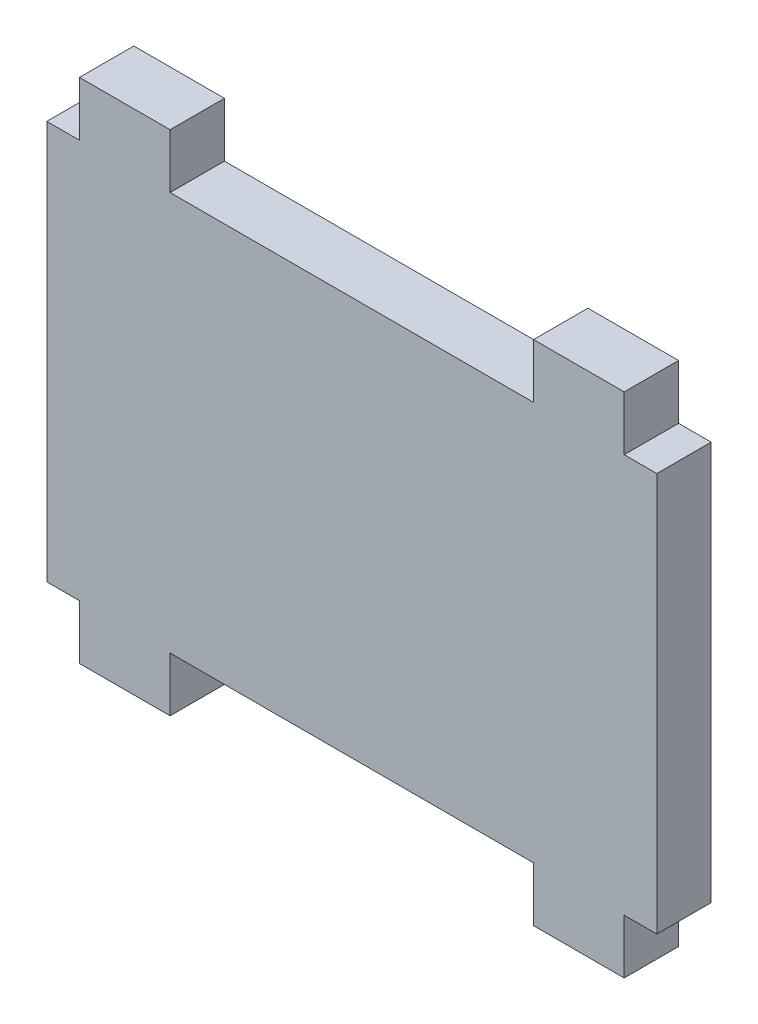
ISO-10303-21;
HEADER;
FILE_DESCRIPTION(('STEP AP214'),'2;1');
FILE_NAME('part.step','',(''),(''),'','','');
FILE_SCHEMA(('AUTOMOTIVE_DESIGN { 1 0 10303 214 1 1 1 1 }'));
ENDSEC;
DATA;
#1=APPLICATION_CONTEXT('core data for automotive mechanical design processes');
#2=APPLICATION_PROTOCOL_DEFINITION('international standard','automotive_design',2000,#1);
#3=PRODUCT_CONTEXT('',#1,'mechanical');
#4=PRODUCT('Part','Part','',(#3));
#5=PRODUCT_RELATED_PRODUCT_CATEGORY('part','',(#4));
#6=PRODUCT_DEFINITION_FORMATION('','',#4);
#7=PRODUCT_DEFINITION_CONTEXT('part definition',#1,'design');
#8=PRODUCT_DEFINITION('design','',#6,#7);
#9=PRODUCT_DEFINITION_SHAPE('','',#8);
#10=(LENGTH_UNIT() NAMED_UNIT(*) SI_UNIT(.MILLI.,.METRE.));
#11=(NAMED_UNIT(*) PLANE_ANGLE_UNIT() SI_UNIT($,.RADIAN.));
#12=(NAMED_UNIT(*) SI_UNIT($,.STERADIAN.) SOLID_ANGLE_UNIT());
#13=UNCERTAINTY_MEASURE_WITH_UNIT(LENGTH_MEASURE(1.E-05),#10,'distance_accuracy_value','');
#14=(GEOMETRIC_REPRESENTATION_CONTEXT(3) GLOBAL_UNCERTAINTY_ASSIGNED_CONTEXT((#13)) GLOBAL_UNIT_ASSIGNED_CONTEXT((#10,
#11,#12)) REPRESENTATION_CONTEXT('',''));
#15=CARTESIAN_POINT('',(0.,0.,0.));
#16=DIRECTION('',(0.,0.,1.));
#17=DIRECTION('',(1.,0.,0.));
#18=AXIS2_PLACEMENT_3D('',#15,#16,#17);
#19=CARTESIAN_POINT('',(6.8,0.,3.));
#20=DIRECTION('',(1.,0.,0.));
#21=DIRECTION('',(0.,0.,-1.));
#22=AXIS2_PLACEMENT_3D('',#19,#20,#21);
#23=PLANE('',#22);
#24=DIRECTION('',(0.,-1.,0.));
#25=VECTOR('',#24,1.);
#26=CARTESIAN_POINT('',(6.8,0.,0.));
#27=LINE('',#26,#25);
#28=CARTESIAN_POINT('',(6.8,0.,0.));
#29=VERTEX_POINT('',#28);
#30=CARTESIAN_POINT('',(6.8,-3.,0.));
#31=VERTEX_POINT('',#30);
#32=EDGE_CURVE('E209',#29,#31,#27,.T.);
#33=ORIENTED_EDGE('',*,*,#32,.F.);
#34=DIRECTION('',(0.,0.,-1.));
#35=VECTOR('',#34,1.);
#36=CARTESIAN_POINT('',(6.8,0.,3.));
#37=LINE('',#36,#35);
#38=CARTESIAN_POINT('',(6.8,0.,3.));
#39=VERTEX_POINT('',#38);
#40=EDGE_CURVE('E11',#39,#29,#37,.T.);
#41=ORIENTED_EDGE('',*,*,#40,.F.);
#42=DIRECTION('',(0.,-1.,0.));
#43=VECTOR('',#42,1.);
#44=CARTESIAN_POINT('',(6.8,0.,3.));
#45=LINE('',#44,#43);
#46=CARTESIAN_POINT('',(6.8,-3.,3.));
#47=VERTEX_POINT('',#46);
#48=EDGE_CURVE('E281',#39,#47,#45,.T.);
#49=ORIENTED_EDGE('',*,*,#48,.T.);
#50=DIRECTION('',(0.,0.,-1.));
#51=VECTOR('',#50,1.);
#52=CARTESIAN_POINT('',(6.8,-3.,3.));
#53=LINE('',#52,#51);
#54=EDGE_CURVE('E127',#47,#31,#53,.T.);
#55=ORIENTED_EDGE('',*,*,#54,.T.);
#56=EDGE_LOOP('',(#33,#41,#49,#55));
#57=FACE_BOUND('',#56,.T.);
#58=ADVANCED_FACE('F39',(#57),#23,.T.);
#59=CARTESIAN_POINT('',(0.,0.,3.));
#60=DIRECTION('',(0.,1.,0.));
#61=DIRECTION('',(0.,0.,1.));
#62=AXIS2_PLACEMENT_3D('',#59,#60,#61);
#63=PLANE('',#62);
#64=DIRECTION('',(1.,0.,0.));
#65=VECTOR('',#64,1.);
#66=CARTESIAN_POINT('',(0.,0.,0.));
#67=LINE('',#66,#65);
#68=CARTESIAN_POINT('',(26.85,0.,0.));
#69=VERTEX_POINT('',#68);
#70=EDGE_CURVE('E213',#29,#69,#67,.T.);
#71=ORIENTED_EDGE('',*,*,#70,.T.);
#72=DIRECTION('',(0.,0.,-1.));
#73=VECTOR('',#72,1.);
#74=CARTESIAN_POINT('',(26.85,0.,3.));
#75=LINE('',#74,#73);
#76=CARTESIAN_POINT('',(26.85,0.,3.));
#77=VERTEX_POINT('',#76);
#78=EDGE_CURVE('E48',#77,#69,#75,.T.);
#79=ORIENTED_EDGE('',*,*,#78,.F.);
#80=DIRECTION('',(1.,0.,0.));
#81=VECTOR('',#80,1.);
#82=CARTESIAN_POINT('',(0.,0.,3.));
#83=LINE('',#82,#81);
#84=EDGE_CURVE('E361',#39,#77,#83,.T.);
#85=ORIENTED_EDGE('',*,*,#84,.F.);
#86=ORIENTED_EDGE('',*,*,#40,.T.);
#87=EDGE_LOOP('',(#71,#79,#85,#86));
#88=FACE_BOUND('',#87,.T.);
#89=ADVANCED_FACE('F414',(#88),#63,.F.);
#90=CARTESIAN_POINT('',(26.85,0.,3.));
#91=DIRECTION('',(1.,0.,0.));
#92=DIRECTION('',(0.,0.,-1.));
#93=AXIS2_PLACEMENT_3D('',#90,#91,#92);
#94=PLANE('',#93);
#95=DIRECTION('',(0.,-1.,0.));
#96=VECTOR('',#95,1.);
#97=CARTESIAN_POINT('',(26.85,0.,0.));
#98=LINE('',#97,#96);
#99=CARTESIAN_POINT('',(26.85,-3.,0.));
#100=VERTEX_POINT('',#99);
#101=EDGE_CURVE('E216',#69,#100,#98,.T.);
#102=ORIENTED_EDGE('',*,*,#101,.T.);
#103=DIRECTION('',(0.,0.,-1.));
#104=VECTOR('',#103,1.);
#105=CARTESIAN_POINT('',(26.85,-3.,3.));
#106=LINE('',#105,#104);
#107=CARTESIAN_POINT('',(26.85,-3.,3.));
#108=VERTEX_POINT('',#107);
#109=EDGE_CURVE('E328',#108,#100,#106,.T.);
#110=ORIENTED_EDGE('',*,*,#109,.F.);
#111=DIRECTION('',(0.,-1.,0.));
#112=VECTOR('',#111,1.);
#113=CARTESIAN_POINT('',(26.85,0.,3.));
#114=LINE('',#113,#112);
#115=EDGE_CURVE('E339',#77,#108,#114,.T.);
#116=ORIENTED_EDGE('',*,*,#115,.F.);
#117=ORIENTED_EDGE('',*,*,#78,.T.);
#118=EDGE_LOOP('',(#102,#110,#116,#117));
#119=FACE_BOUND('',#118,.T.);
#120=ADVANCED_FACE('F337',(#119),#94,.F.);
#121=CARTESIAN_POINT('',(0.,-3.,3.));
#122=DIRECTION('',(0.,1.,0.));
#123=DIRECTION('',(0.,0.,1.));
#124=AXIS2_PLACEMENT_3D('',#121,#122,#123);
#125=PLANE('',#124);
#126=DIRECTION('',(1.,0.,0.));
#127=VECTOR('',#126,1.);
#128=CARTESIAN_POINT('',(0.,-3.,0.));
#129=LINE('',#128,#127);
#130=CARTESIAN_POINT('',(31.85,-3.,0.));
#131=VERTEX_POINT('',#130);
#132=EDGE_CURVE('E219',#100,#131,#129,.T.);
#133=ORIENTED_EDGE('',*,*,#132,.T.);
#134=DIRECTION('',(0.,0.,-1.));
#135=VECTOR('',#134,1.);
#136=CARTESIAN_POINT('',(31.85,-3.,3.));
#137=LINE('',#136,#135);
#138=CARTESIAN_POINT('',(31.85,-3.,3.));
#139=VERTEX_POINT('',#138);
#140=EDGE_CURVE('E325',#139,#131,#137,.T.);
#141=ORIENTED_EDGE('',*,*,#140,.F.);
#142=DIRECTION('',(1.,0.,0.));
#143=VECTOR('',#142,1.);
#144=CARTESIAN_POINT('',(0.,-3.,3.));
#145=LINE('',#144,#143);
#146=EDGE_CURVE('E352',#108,#139,#145,.T.);
#147=ORIENTED_EDGE('',*,*,#146,.F.);
#148=ORIENTED_EDGE('',*,*,#109,.T.);
#149=EDGE_LOOP('',(#133,#141,#147,#148));
#150=FACE_BOUND('',#149,.T.);
#151=ADVANCED_FACE('F349',(#150),#125,.F.);
#152=CARTESIAN_POINT('',(31.85,0.,3.));
#153=DIRECTION('',(1.,0.,0.));
#154=DIRECTION('',(0.,0.,-1.));
#155=AXIS2_PLACEMENT_3D('',#152,#153,#154);
#156=PLANE('',#155);
#157=DIRECTION('',(0.,-1.,0.));
#158=VECTOR('',#157,1.);
#159=CARTESIAN_POINT('',(31.85,0.,0.));
#160=LINE('',#159,#158);
#161=CARTESIAN_POINT('',(31.85,0.,0.));
#162=VERTEX_POINT('',#161);
#163=EDGE_CURVE('E223',#162,#131,#160,.T.);
#164=ORIENTED_EDGE('',*,*,#163,.F.);
#165=DIRECTION('',(0.,0.,-1.));
#166=VECTOR('',#165,1.);
#167=CARTESIAN_POINT('',(31.85,0.,3.));
#168=LINE('',#167,#166);
#169=CARTESIAN_POINT('',(31.85,0.,3.));
#170=VERTEX_POINT('',#169);
#171=EDGE_CURVE('E322',#170,#162,#168,.T.);
#172=ORIENTED_EDGE('',*,*,#171,.F.);
#173=DIRECTION('',(0.,-1.,0.));
#174=VECTOR('',#173,1.);
#175=CARTESIAN_POINT('',(31.85,0.,3.));
#176=LINE('',#175,#174);
#177=EDGE_CURVE('E355',#170,#139,#176,.T.);
#178=ORIENTED_EDGE('',*,*,#177,.T.);
#179=ORIENTED_EDGE('',*,*,#140,.T.);
#180=EDGE_LOOP('',(#164,#172,#178,#179));
#181=FACE_BOUND('',#180,.T.);
#182=ADVANCED_FACE('F424',(#181),#156,.T.);
#183=CARTESIAN_POINT('',(0.,0.,3.));
#184=DIRECTION('',(0.,1.,0.));
#185=DIRECTION('',(0.,0.,1.));
#186=AXIS2_PLACEMENT_3D('',#183,#184,#185);
#187=PLANE('',#186);
#188=DIRECTION('',(1.,0.,0.));
#189=VECTOR('',#188,1.);
#190=CARTESIAN_POINT('',(0.,0.,0.));
#191=LINE('',#190,#189);
#192=CARTESIAN_POINT('',(33.65,0.,0.));
#193=VERTEX_POINT('',#192);
#194=EDGE_CURVE('E227',#162,#193,#191,.T.);
#195=ORIENTED_EDGE('',*,*,#194,.T.);
#196=DIRECTION('',(0.,0.,-1.));
#197=VECTOR('',#196,1.);
#198=CARTESIAN_POINT('',(33.65,0.,3.));
#199=LINE('',#198,#197);
#200=CARTESIAN_POINT('',(33.65,0.,3.));
#201=VERTEX_POINT('',#200);
#202=EDGE_CURVE('E318',#201,#193,#199,.T.);
#203=ORIENTED_EDGE('',*,*,#202,.F.);
#204=DIRECTION('',(1.,0.,0.));
#205=VECTOR('',#204,1.);
#206=CARTESIAN_POINT('',(0.,0.,3.));
#207=LINE('',#206,#205);
#208=EDGE_CURVE('E359',#170,#201,#207,.T.);
#209=ORIENTED_EDGE('',*,*,#208,.F.);
#210=ORIENTED_EDGE('',*,*,#171,.T.);
#211=EDGE_LOOP('',(#195,#203,#209,#210));
#212=FACE_BOUND('',#211,.T.);
#213=ADVANCED_FACE('F427',(#212),#187,.F.);
#214=CARTESIAN_POINT('',(33.65,0.,3.));
#215=DIRECTION('',(-1.,0.,0.));
#216=DIRECTION('',(0.,0.,1.));
#217=AXIS2_PLACEMENT_3D('',#214,#215,#216);
#218=PLANE('',#217);
#219=DIRECTION('',(0.,1.,0.));
#220=VECTOR('',#219,1.);
#221=CARTESIAN_POINT('',(33.65,0.,0.));
#222=LINE('',#221,#220);
#223=CARTESIAN_POINT('',(33.65,22.,0.));
#224=VERTEX_POINT('',#223);
#225=EDGE_CURVE('E230',#193,#224,#222,.T.);
#226=ORIENTED_EDGE('',*,*,#225,.T.);
#227=DIRECTION('',(0.,0.,-1.));
#228=VECTOR('',#227,1.);
#229=CARTESIAN_POINT('',(33.65,22.,3.));
#230=LINE('',#229,#228);
#231=CARTESIAN_POINT('',(33.65,22.,3.));
#232=VERTEX_POINT('',#231);
#233=EDGE_CURVE('E315',#232,#224,#230,.T.);
#234=ORIENTED_EDGE('',*,*,#233,.F.);
#235=DIRECTION('',(0.,1.,0.));
#236=VECTOR('',#235,1.);
#237=CARTESIAN_POINT('',(33.65,0.,3.));
#238=LINE('',#237,#236);
#239=EDGE_CURVE('E367',#201,#232,#238,.T.);
#240=ORIENTED_EDGE('',*,*,#239,.F.);
#241=ORIENTED_EDGE('',*,*,#202,.T.);
#242=EDGE_LOOP('',(#226,#234,#240,#241));
#243=FACE_BOUND('',#242,.T.);
#244=ADVANCED_FACE('F431',(#243),#218,.F.);
#245=CARTESIAN_POINT('',(0.,22.,3.));
#246=DIRECTION('',(0.,1.,0.));
#247=DIRECTION('',(0.,0.,1.));
#248=AXIS2_PLACEMENT_3D('',#245,#246,#247);
#249=PLANE('',#248);
#250=DIRECTION('',(1.,0.,0.));
#251=VECTOR('',#250,1.);
#252=CARTESIAN_POINT('',(0.,22.,0.));
#253=LINE('',#252,#251);
#254=CARTESIAN_POINT('',(31.85,22.,0.));
#255=VERTEX_POINT('',#254);
#256=EDGE_CURVE('E234',#255,#224,#253,.T.);
#257=ORIENTED_EDGE('',*,*,#256,.F.);
#258=DIRECTION('',(0.,0.,-1.));
#259=VECTOR('',#258,1.);
#260=CARTESIAN_POINT('',(31.85,22.,3.));
#261=LINE('',#260,#259);
#262=CARTESIAN_POINT('',(31.85,22.,3.));
#263=VERTEX_POINT('',#262);
#264=EDGE_CURVE('E312',#263,#255,#261,.T.);
#265=ORIENTED_EDGE('',*,*,#264,.F.);
#266=DIRECTION('',(1.,0.,0.));
#267=VECTOR('',#266,1.);
#268=CARTESIAN_POINT('',(0.,22.,3.));
#269=LINE('',#268,#267);
#270=EDGE_CURVE('E370',#263,#232,#269,.T.);
#271=ORIENTED_EDGE('',*,*,#270,.T.);
#272=ORIENTED_EDGE('',*,*,#233,.T.);
#273=EDGE_LOOP('',(#257,#265,#271,#272));
#274=FACE_BOUND('',#273,.T.);
#275=ADVANCED_FACE('F435',(#274),#249,.T.);
#276=CARTESIAN_POINT('',(31.85,0.,3.));
#277=DIRECTION('',(-1.,0.,0.));
#278=DIRECTION('',(0.,0.,1.));
#279=AXIS2_PLACEMENT_3D('',#276,#277,#278);
#280=PLANE('',#279);
#281=DIRECTION('',(0.,1.,0.));
#282=VECTOR('',#281,1.);
#283=CARTESIAN_POINT('',(31.85,0.,0.));
#284=LINE('',#283,#282);
#285=CARTESIAN_POINT('',(31.85,25.,0.));
#286=VERTEX_POINT('',#285);
#287=EDGE_CURVE('E238',#255,#286,#284,.T.);
#288=ORIENTED_EDGE('',*,*,#287,.T.);
#289=DIRECTION('',(0.,0.,-1.));
#290=VECTOR('',#289,1.);
#291=CARTESIAN_POINT('',(31.85,25.,3.));
#292=LINE('',#291,#290);
#293=CARTESIAN_POINT('',(31.85,25.,3.));
#294=VERTEX_POINT('',#293);
#295=EDGE_CURVE('E309',#294,#286,#292,.T.);
#296=ORIENTED_EDGE('',*,*,#295,.F.);
#297=DIRECTION('',(0.,1.,0.));
#298=VECTOR('',#297,1.);
#299=CARTESIAN_POINT('',(31.85,0.,3.));
#300=LINE('',#299,#298);
#301=EDGE_CURVE('E374',#263,#294,#300,.T.);
#302=ORIENTED_EDGE('',*,*,#301,.F.);
#303=ORIENTED_EDGE('',*,*,#264,.T.);
#304=EDGE_LOOP('',(#288,#296,#302,#303));
#305=FACE_BOUND('',#304,.T.);
#306=ADVANCED_FACE('F439',(#305),#280,.F.);
#307=CARTESIAN_POINT('',(0.,25.,3.));
#308=DIRECTION('',(0.,1.,0.));
#309=DIRECTION('',(0.,0.,1.));
#310=AXIS2_PLACEMENT_3D('',#307,#308,#309);
#311=PLANE('',#310);
#312=DIRECTION('',(1.,0.,0.));
#313=VECTOR('',#312,1.);
#314=CARTESIAN_POINT('',(0.,25.,0.));
#315=LINE('',#314,#313);
#316=CARTESIAN_POINT('',(26.85,25.,0.));
#317=VERTEX_POINT('',#316);
#318=EDGE_CURVE('E242',#317,#286,#315,.T.);
#319=ORIENTED_EDGE('',*,*,#318,.F.);
#320=DIRECTION('',(0.,0.,-1.));
#321=VECTOR('',#320,1.);
#322=CARTESIAN_POINT('',(26.85,25.,3.));
#323=LINE('',#322,#321);
#324=CARTESIAN_POINT('',(26.85,25.,3.));
#325=VERTEX_POINT('',#324);
#326=EDGE_CURVE('E306',#325,#317,#323,.T.);
#327=ORIENTED_EDGE('',*,*,#326,.F.);
#328=DIRECTION('',(1.,0.,0.));
#329=VECTOR('',#328,1.);
#330=CARTESIAN_POINT('',(0.,25.,3.));
#331=LINE('',#330,#329);
#332=EDGE_CURVE('E377',#325,#294,#331,.T.);
#333=ORIENTED_EDGE('',*,*,#332,.T.);
#334=ORIENTED_EDGE('',*,*,#295,.T.);
#335=EDGE_LOOP('',(#319,#327,#333,#334));
#336=FACE_BOUND('',#335,.T.);
#337=ADVANCED_FACE('F443',(#336),#311,.T.);
#338=CARTESIAN_POINT('',(26.85,0.,3.));
#339=DIRECTION('',(-1.,0.,0.));
#340=DIRECTION('',(0.,0.,1.));
#341=AXIS2_PLACEMENT_3D('',#338,#339,#340);
#342=PLANE('',#341);
#343=DIRECTION('',(0.,1.,0.));
#344=VECTOR('',#343,1.);
#345=CARTESIAN_POINT('',(26.85,0.,0.));
#346=LINE('',#345,#344);
#347=CARTESIAN_POINT('',(26.85,22.,0.));
#348=VERTEX_POINT('',#347);
#349=EDGE_CURVE('E246',#348,#317,#346,.T.);
#350=ORIENTED_EDGE('',*,*,#349,.F.);
#351=DIRECTION('',(0.,0.,-1.));
#352=VECTOR('',#351,1.);
#353=CARTESIAN_POINT('',(26.85,22.,3.));
#354=LINE('',#353,#352);
#355=CARTESIAN_POINT('',(26.85,22.,3.));
#356=VERTEX_POINT('',#355);
#357=EDGE_CURVE('E303',#356,#348,#354,.T.);
#358=ORIENTED_EDGE('',*,*,#357,.F.);
#359=DIRECTION('',(0.,1.,0.));
#360=VECTOR('',#359,1.);
#361=CARTESIAN_POINT('',(26.85,0.,3.));
#362=LINE('',#361,#360);
#363=EDGE_CURVE('E381',#356,#325,#362,.T.);
#364=ORIENTED_EDGE('',*,*,#363,.T.);
#365=ORIENTED_EDGE('',*,*,#326,.T.);
#366=EDGE_LOOP('',(#350,#358,#364,#365));
#367=FACE_BOUND('',#366,.T.);
#368=ADVANCED_FACE('F447',(#367),#342,.T.);
#369=CARTESIAN_POINT('',(0.,22.,3.));
#370=DIRECTION('',(0.,1.,0.));
#371=DIRECTION('',(0.,0.,1.));
#372=AXIS2_PLACEMENT_3D('',#369,#370,#371);
#373=PLANE('',#372);
#374=DIRECTION('',(1.,0.,0.));
#375=VECTOR('',#374,1.);
#376=CARTESIAN_POINT('',(0.,22.,0.));
#377=LINE('',#376,#375);
#378=CARTESIAN_POINT('',(6.8,22.,0.));
#379=VERTEX_POINT('',#378);
#380=EDGE_CURVE('E250',#379,#348,#377,.T.);
#381=ORIENTED_EDGE('',*,*,#380,.F.);
#382=DIRECTION('',(0.,0.,-1.));
#383=VECTOR('',#382,1.);
#384=CARTESIAN_POINT('',(6.8,22.,3.));
#385=LINE('',#384,#383);
#386=CARTESIAN_POINT('',(6.8,22.,3.));
#387=VERTEX_POINT('',#386);
#388=EDGE_CURVE('E300',#387,#379,#385,.T.);
#389=ORIENTED_EDGE('',*,*,#388,.F.);
#390=DIRECTION('',(1.,0.,0.));
#391=VECTOR('',#390,1.);
#392=CARTESIAN_POINT('',(0.,22.,3.));
#393=LINE('',#392,#391);
#394=EDGE_CURVE('E385',#387,#356,#393,.T.);
#395=ORIENTED_EDGE('',*,*,#394,.T.);
#396=ORIENTED_EDGE('',*,*,#357,.T.);
#397=EDGE_LOOP('',(#381,#389,#395,#396));
#398=FACE_BOUND('',#397,.T.);
#399=ADVANCED_FACE('F451',(#398),#373,.T.);
#400=CARTESIAN_POINT('',(6.8,0.,3.));
#401=DIRECTION('',(-1.,0.,0.));
#402=DIRECTION('',(0.,0.,1.));
#403=AXIS2_PLACEMENT_3D('',#400,#401,#402);
#404=PLANE('',#403);
#405=DIRECTION('',(0.,1.,0.));
#406=VECTOR('',#405,1.);
#407=CARTESIAN_POINT('',(6.8,0.,0.));
#408=LINE('',#407,#406);
#409=CARTESIAN_POINT('',(6.8,25.,0.));
#410=VERTEX_POINT('',#409);
#411=EDGE_CURVE('E254',#379,#410,#408,.T.);
#412=ORIENTED_EDGE('',*,*,#411,.T.);
#413=DIRECTION('',(0.,0.,-1.));
#414=VECTOR('',#413,1.);
#415=CARTESIAN_POINT('',(6.8,25.,3.));
#416=LINE('',#415,#414);
#417=CARTESIAN_POINT('',(6.8,25.,3.));
#418=VERTEX_POINT('',#417);
#419=EDGE_CURVE('E297',#418,#410,#416,.T.);
#420=ORIENTED_EDGE('',*,*,#419,.F.);
#421=DIRECTION('',(0.,1.,0.));
#422=VECTOR('',#421,1.);
#423=CARTESIAN_POINT('',(6.8,0.,3.));
#424=LINE('',#423,#422);
#425=EDGE_CURVE('E389',#387,#418,#424,.T.);
#426=ORIENTED_EDGE('',*,*,#425,.F.);
#427=ORIENTED_EDGE('',*,*,#388,.T.);
#428=EDGE_LOOP('',(#412,#420,#426,#427));
#429=FACE_BOUND('',#428,.T.);
#430=ADVANCED_FACE('F455',(#429),#404,.F.);
#431=CARTESIAN_POINT('',(0.,25.,3.));
#432=DIRECTION('',(0.,1.,0.));
#433=DIRECTION('',(0.,0.,1.));
#434=AXIS2_PLACEMENT_3D('',#431,#432,#433);
#435=PLANE('',#434);
#436=DIRECTION('',(1.,0.,0.));
#437=VECTOR('',#436,1.);
#438=CARTESIAN_POINT('',(0.,25.,0.));
#439=LINE('',#438,#437);
#440=CARTESIAN_POINT('',(1.8,25.,0.));
#441=VERTEX_POINT('',#440);
#442=EDGE_CURVE('E258',#441,#410,#439,.T.);
#443=ORIENTED_EDGE('',*,*,#442,.F.);
#444=DIRECTION('',(0.,0.,-1.));
#445=VECTOR('',#444,1.);
#446=CARTESIAN_POINT('',(1.8,25.,3.));
#447=LINE('',#446,#445);
#448=CARTESIAN_POINT('',(1.8,25.,3.));
#449=VERTEX_POINT('',#448);
#450=EDGE_CURVE('E294',#449,#441,#447,.T.);
#451=ORIENTED_EDGE('',*,*,#450,.F.);
#452=DIRECTION('',(1.,0.,0.));
#453=VECTOR('',#452,1.);
#454=CARTESIAN_POINT('',(0.,25.,3.));
#455=LINE('',#454,#453);
#456=EDGE_CURVE('E392',#449,#418,#455,.T.);
#457=ORIENTED_EDGE('',*,*,#456,.T.);
#458=ORIENTED_EDGE('',*,*,#419,.T.);
#459=EDGE_LOOP('',(#443,#451,#457,#458));
#460=FACE_BOUND('',#459,.T.);
#461=ADVANCED_FACE('F459',(#460),#435,.T.);
#462=CARTESIAN_POINT('',(1.8,0.,3.));
#463=DIRECTION('',(-1.,0.,0.));
#464=DIRECTION('',(0.,0.,1.));
#465=AXIS2_PLACEMENT_3D('',#462,#463,#464);
#466=PLANE('',#465);
#467=DIRECTION('',(0.,1.,0.));
#468=VECTOR('',#467,1.);
#469=CARTESIAN_POINT('',(1.8,0.,0.));
#470=LINE('',#469,#468);
#471=CARTESIAN_POINT('',(1.8,22.,0.));
#472=VERTEX_POINT('',#471);
#473=EDGE_CURVE('E262',#472,#441,#470,.T.);
#474=ORIENTED_EDGE('',*,*,#473,.F.);
#475=DIRECTION('',(0.,0.,-1.));
#476=VECTOR('',#475,1.);
#477=CARTESIAN_POINT('',(1.8,22.,3.));
#478=LINE('',#477,#476);
#479=CARTESIAN_POINT('',(1.8,22.,3.));
#480=VERTEX_POINT('',#479);
#481=EDGE_CURVE('E291',#480,#472,#478,.T.);
#482=ORIENTED_EDGE('',*,*,#481,.F.);
#483=DIRECTION('',(0.,1.,0.));
#484=VECTOR('',#483,1.);
#485=CARTESIAN_POINT('',(1.8,0.,3.));
#486=LINE('',#485,#484);
#487=EDGE_CURVE('E396',#480,#449,#486,.T.);
#488=ORIENTED_EDGE('',*,*,#487,.T.);
#489=ORIENTED_EDGE('',*,*,#450,.T.);
#490=EDGE_LOOP('',(#474,#482,#488,#489));
#491=FACE_BOUND('',#490,.T.);
#492=ADVANCED_FACE('F463',(#491),#466,.T.);
#493=CARTESIAN_POINT('',(0.,22.,3.));
#494=DIRECTION('',(0.,1.,0.));
#495=DIRECTION('',(0.,0.,1.));
#496=AXIS2_PLACEMENT_3D('',#493,#494,#495);
#497=PLANE('',#496);
#498=DIRECTION('',(1.,0.,0.));
#499=VECTOR('',#498,1.);
#500=CARTESIAN_POINT('',(0.,22.,0.));
#501=LINE('',#500,#499);
#502=CARTESIAN_POINT('',(0.,22.,0.));
#503=VERTEX_POINT('',#502);
#504=EDGE_CURVE('E266',#503,#472,#501,.T.);
#505=ORIENTED_EDGE('',*,*,#504,.F.);
#506=DIRECTION('',(0.,0.,-1.));
#507=VECTOR('',#506,1.);
#508=CARTESIAN_POINT('',(0.,22.,3.));
#509=LINE('',#508,#507);
#510=CARTESIAN_POINT('',(0.,22.,3.));
#511=VERTEX_POINT('',#510);
#512=EDGE_CURVE('E288',#511,#503,#509,.T.);
#513=ORIENTED_EDGE('',*,*,#512,.F.);
#514=DIRECTION('',(1.,0.,0.));
#515=VECTOR('',#514,1.);
#516=CARTESIAN_POINT('',(0.,22.,3.));
#517=LINE('',#516,#515);
#518=EDGE_CURVE('E400',#511,#480,#517,.T.);
#519=ORIENTED_EDGE('',*,*,#518,.T.);
#520=ORIENTED_EDGE('',*,*,#481,.T.);
#521=EDGE_LOOP('',(#505,#513,#519,#520));
#522=FACE_BOUND('',#521,.T.);
#523=ADVANCED_FACE('F467',(#522),#497,.T.);
#524=CARTESIAN_POINT('',(0.,0.,3.));
#525=DIRECTION('',(-1.,0.,0.));
#526=DIRECTION('',(0.,0.,1.));
#527=AXIS2_PLACEMENT_3D('',#524,#525,#526);
#528=PLANE('',#527);
#529=DIRECTION('',(0.,1.,0.));
#530=VECTOR('',#529,1.);
#531=CARTESIAN_POINT('',(0.,0.,0.));
#532=LINE('',#531,#530);
#533=CARTESIAN_POINT('',(0.,0.,0.));
#534=VERTEX_POINT('',#533);
#535=EDGE_CURVE('E270',#534,#503,#532,.T.);
#536=ORIENTED_EDGE('',*,*,#535,.F.);
#537=DIRECTION('',(0.,0.,-1.));
#538=VECTOR('',#537,1.);
#539=CARTESIAN_POINT('',(0.,0.,3.));
#540=LINE('',#539,#538);
#541=CARTESIAN_POINT('',(0.,0.,3.));
#542=VERTEX_POINT('',#541);
#543=EDGE_CURVE('E199',#542,#534,#540,.T.);
#544=ORIENTED_EDGE('',*,*,#543,.F.);
#545=DIRECTION('',(0.,1.,0.));
#546=VECTOR('',#545,1.);
#547=CARTESIAN_POINT('',(0.,0.,3.));
#548=LINE('',#547,#546);
#549=EDGE_CURVE('E190',#542,#511,#548,.T.);
#550=ORIENTED_EDGE('',*,*,#549,.T.);
#551=ORIENTED_EDGE('',*,*,#512,.T.);
#552=EDGE_LOOP('',(#536,#544,#550,#551));
#553=FACE_BOUND('',#552,.T.);
#554=ADVANCED_FACE('F406',(#553),#528,.T.);
#555=CARTESIAN_POINT('',(0.,0.,3.));
#556=DIRECTION('',(0.,1.,0.));
#557=DIRECTION('',(0.,0.,1.));
#558=AXIS2_PLACEMENT_3D('',#555,#556,#557);
#559=PLANE('',#558);
#560=DIRECTION('',(1.,0.,0.));
#561=VECTOR('',#560,1.);
#562=CARTESIAN_POINT('',(0.,0.,0.));
#563=LINE('',#562,#561);
#564=CARTESIAN_POINT('',(1.8,0.,0.));
#565=VERTEX_POINT('',#564);
#566=EDGE_CURVE('E197',#534,#565,#563,.T.);
#567=ORIENTED_EDGE('',*,*,#566,.T.);
#568=DIRECTION('',(0.,0.,-1.));
#569=VECTOR('',#568,1.);
#570=CARTESIAN_POINT('',(1.8,0.,3.));
#571=LINE('',#570,#569);
#572=CARTESIAN_POINT('',(1.8,0.,3.));
#573=VERTEX_POINT('',#572);
#574=EDGE_CURVE('E194',#573,#565,#571,.T.);
#575=ORIENTED_EDGE('',*,*,#574,.F.);
#576=DIRECTION('',(1.,0.,0.));
#577=VECTOR('',#576,1.);
#578=CARTESIAN_POINT('',(0.,0.,3.));
#579=LINE('',#578,#577);
#580=EDGE_CURVE('E183',#542,#573,#579,.T.);
#581=ORIENTED_EDGE('',*,*,#580,.F.);
#582=ORIENTED_EDGE('',*,*,#543,.T.);
#583=EDGE_LOOP('',(#567,#575,#581,#582));
#584=FACE_BOUND('',#583,.T.);
#585=ADVANCED_FACE('F195',(#584),#559,.F.);
#586=CARTESIAN_POINT('',(1.8,0.,3.));
#587=DIRECTION('',(1.,0.,0.));
#588=DIRECTION('',(0.,1.,0.));
#589=AXIS2_PLACEMENT_3D('',#586,#587,#588);
#590=PLANE('',#589);
#591=DIRECTION('',(0.,-1.,0.));
#592=VECTOR('',#591,1.);
#593=CARTESIAN_POINT('',(1.8,0.,0.));
#594=LINE('',#593,#592);
#595=CARTESIAN_POINT('',(1.8,-3.,0.));
#596=VERTEX_POINT('',#595);
#597=EDGE_CURVE('E120',#565,#596,#594,.T.);
#598=ORIENTED_EDGE('',*,*,#597,.T.);
#599=DIRECTION('',(0.,0.,-1.));
#600=VECTOR('',#599,1.);
#601=CARTESIAN_POINT('',(1.8,-3.,3.));
#602=LINE('',#601,#600);
#603=CARTESIAN_POINT('',(1.8,-3.,3.));
#604=VERTEX_POINT('',#603);
#605=EDGE_CURVE('E200',#604,#596,#602,.T.);
#606=ORIENTED_EDGE('',*,*,#605,.F.);
#607=DIRECTION('',(0.,-1.,0.));
#608=VECTOR('',#607,1.);
#609=CARTESIAN_POINT('',(1.8,0.,3.));
#610=LINE('',#609,#608);
#611=EDGE_CURVE('E187',#573,#604,#610,.T.);
#612=ORIENTED_EDGE('',*,*,#611,.F.);
#613=ORIENTED_EDGE('',*,*,#574,.T.);
#614=EDGE_LOOP('',(#598,#606,#612,#613));
#615=FACE_BOUND('',#614,.T.);
#616=ADVANCED_FACE('F202',(#615),#590,.F.);
#617=CARTESIAN_POINT('',(0.,-3.,3.));
#618=DIRECTION('',(0.,1.,0.));
#619=DIRECTION('',(0.,0.,1.));
#620=AXIS2_PLACEMENT_3D('',#617,#618,#619);
#621=PLANE('',#620);
#622=DIRECTION('',(1.,0.,0.));
#623=VECTOR('',#622,1.);
#624=CARTESIAN_POINT('',(0.,-3.,0.));
#625=LINE('',#624,#623);
#626=EDGE_CURVE('E278',#596,#31,#625,.T.);
#627=ORIENTED_EDGE('',*,*,#626,.T.);
#628=ORIENTED_EDGE('',*,*,#54,.F.);
#629=DIRECTION('',(1.,0.,0.));
#630=VECTOR('',#629,1.);
#631=CARTESIAN_POINT('',(0.,-3.,3.));
#632=LINE('',#631,#630);
#633=EDGE_CURVE('E56',#604,#47,#632,.T.);
#634=ORIENTED_EDGE('',*,*,#633,.F.);
#635=ORIENTED_EDGE('',*,*,#605,.T.);
#636=EDGE_LOOP('',(#627,#628,#634,#635));
#637=FACE_BOUND('',#636,.T.);
#638=ADVANCED_FACE('F410',(#637),#621,.F.);
#639=CARTESIAN_POINT('',(0.,0.,3.));
#640=DIRECTION('',(0.,0.,1.));
#641=DIRECTION('',(1.,0.,0.));
#642=AXIS2_PLACEMENT_3D('',#639,#640,#641);
#643=PLANE('',#642);
#644=ORIENTED_EDGE('',*,*,#48,.F.);
#645=ORIENTED_EDGE('',*,*,#84,.T.);
#646=ORIENTED_EDGE('',*,*,#115,.T.);
#647=ORIENTED_EDGE('',*,*,#146,.T.);
#648=ORIENTED_EDGE('',*,*,#177,.F.);
#649=ORIENTED_EDGE('',*,*,#208,.T.);
#650=ORIENTED_EDGE('',*,*,#239,.T.);
#651=ORIENTED_EDGE('',*,*,#270,.F.);
#652=ORIENTED_EDGE('',*,*,#301,.T.);
#653=ORIENTED_EDGE('',*,*,#332,.F.);
#654=ORIENTED_EDGE('',*,*,#363,.F.);
#655=ORIENTED_EDGE('',*,*,#394,.F.);
#656=ORIENTED_EDGE('',*,*,#425,.T.);
#657=ORIENTED_EDGE('',*,*,#456,.F.);
#658=ORIENTED_EDGE('',*,*,#487,.F.);
#659=ORIENTED_EDGE('',*,*,#518,.F.);
#660=ORIENTED_EDGE('',*,*,#549,.F.);
#661=ORIENTED_EDGE('',*,*,#580,.T.);
#662=ORIENTED_EDGE('',*,*,#611,.T.);
#663=ORIENTED_EDGE('',*,*,#633,.T.);
#664=EDGE_LOOP('',(#644,#645,#646,#647,#648,#649,#650,#651,#652,#653,#654,#655,#656,#657,#658,
#659,#660,#661,#662,#663));
#665=FACE_BOUND('',#664,.T.);
#666=ADVANCED_FACE('F185',(#665),#643,.T.);
#667=CARTESIAN_POINT('',(0.,0.,0.));
#668=DIRECTION('',(0.,0.,1.));
#669=DIRECTION('',(1.,0.,0.));
#670=AXIS2_PLACEMENT_3D('',#667,#668,#669);
#671=PLANE('',#670);
#672=ORIENTED_EDGE('',*,*,#32,.T.);
#673=ORIENTED_EDGE('',*,*,#626,.F.);
#674=ORIENTED_EDGE('',*,*,#597,.F.);
#675=ORIENTED_EDGE('',*,*,#566,.F.);
#676=ORIENTED_EDGE('',*,*,#535,.T.);
#677=ORIENTED_EDGE('',*,*,#504,.T.);
#678=ORIENTED_EDGE('',*,*,#473,.T.);
#679=ORIENTED_EDGE('',*,*,#442,.T.);
#680=ORIENTED_EDGE('',*,*,#411,.F.);
#681=ORIENTED_EDGE('',*,*,#380,.T.);
#682=ORIENTED_EDGE('',*,*,#349,.T.);
#683=ORIENTED_EDGE('',*,*,#318,.T.);
#684=ORIENTED_EDGE('',*,*,#287,.F.);
#685=ORIENTED_EDGE('',*,*,#256,.T.);
#686=ORIENTED_EDGE('',*,*,#225,.F.);
#687=ORIENTED_EDGE('',*,*,#194,.F.);
#688=ORIENTED_EDGE('',*,*,#163,.T.);
#689=ORIENTED_EDGE('',*,*,#132,.F.);
#690=ORIENTED_EDGE('',*,*,#101,.F.);
#691=ORIENTED_EDGE('',*,*,#70,.F.);
#692=EDGE_LOOP('',(#672,#673,#674,#675,#676,#677,#678,#679,#680,#681,#682,#683,#684,#685,#686,
#687,#688,#689,#690,#691));
#693=FACE_BOUND('',#692,.T.);
#694=ADVANCED_FACE('F344',(#693),#671,.F.);
#695=CLOSED_SHELL('',(#58,#89,#120,#151,#182,#213,#244,#275,#306,#337,#368,#399,#430,#461,#492,
#523,#554,#585,#616,#638,#666,#694));
#696=MANIFOLD_SOLID_BREP('B2',#695);
#697=ADVANCED_BREP_SHAPE_REPRESENTATION('',(#18,#696),#14);
#698=SHAPE_DEFINITION_REPRESENTATION(#9,#697);
ENDSEC;
END-ISO-10303-21;
